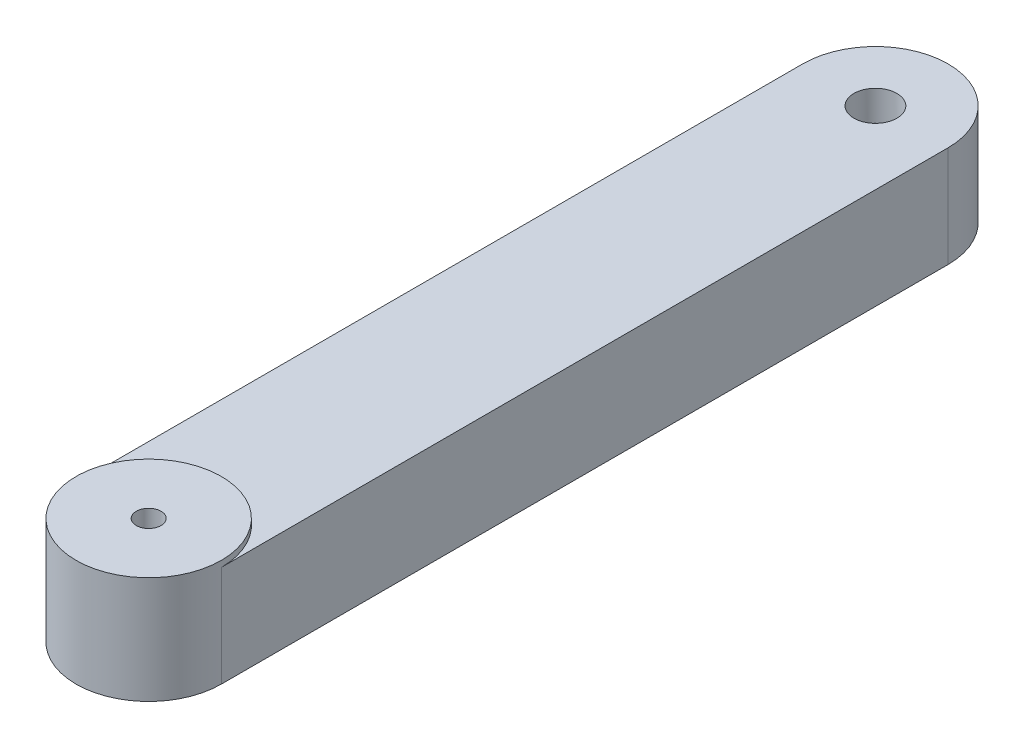
ISO-10303-21;
HEADER;
FILE_DESCRIPTION(('STEP AP214'),'2;1');
FILE_NAME('part.step','',(''),(''),'','','');
FILE_SCHEMA(('AUTOMOTIVE_DESIGN { 1 0 10303 214 1 1 1 1 }'));
ENDSEC;
DATA;
#1=APPLICATION_CONTEXT('core data for automotive mechanical design processes');
#2=APPLICATION_PROTOCOL_DEFINITION('international standard','automotive_design',2000,#1);
#3=PRODUCT_CONTEXT('',#1,'mechanical');
#4=PRODUCT('Part','Part','',(#3));
#5=PRODUCT_RELATED_PRODUCT_CATEGORY('part','',(#4));
#6=PRODUCT_DEFINITION_FORMATION('','',#4);
#7=PRODUCT_DEFINITION_CONTEXT('part definition',#1,'design');
#8=PRODUCT_DEFINITION('design','',#6,#7);
#9=PRODUCT_DEFINITION_SHAPE('','',#8);
#10=(LENGTH_UNIT() NAMED_UNIT(*) SI_UNIT(.MILLI.,.METRE.));
#11=(NAMED_UNIT(*) PLANE_ANGLE_UNIT() SI_UNIT($,.RADIAN.));
#12=(NAMED_UNIT(*) SI_UNIT($,.STERADIAN.) SOLID_ANGLE_UNIT());
#13=UNCERTAINTY_MEASURE_WITH_UNIT(LENGTH_MEASURE(1.E-05),#10,'distance_accuracy_value','');
#14=(GEOMETRIC_REPRESENTATION_CONTEXT(3) GLOBAL_UNCERTAINTY_ASSIGNED_CONTEXT((#13)) GLOBAL_UNIT_ASSIGNED_CONTEXT((#10,
#11,#12)) REPRESENTATION_CONTEXT('',''));
#15=CARTESIAN_POINT('',(0.,0.,0.));
#16=DIRECTION('',(0.,0.,1.));
#17=DIRECTION('',(1.,0.,0.));
#18=AXIS2_PLACEMENT_3D('',#15,#16,#17);
#19=CARTESIAN_POINT('',(0.,17.7,60.));
#20=DIRECTION('',(0.,1.,0.));
#21=DIRECTION('',(0.,0.,1.));
#22=AXIS2_PLACEMENT_3D('',#19,#20,#21);
#23=PLANE('',#22);
#24=CARTESIAN_POINT('',(0.,17.7,60.));
#25=DIRECTION('',(0.,1.,0.));
#26=DIRECTION('',(0.,0.,1.));
#27=AXIS2_PLACEMENT_3D('',#24,#25,#26);
#28=CIRCLE('',#27,2.05);
#29=CARTESIAN_POINT('',(0.,17.7,62.05));
#30=VERTEX_POINT('',#29);
#31=EDGE_CURVE('E116',#30,#30,#28,.T.);
#32=ORIENTED_EDGE('',*,*,#31,.F.);
#33=EDGE_LOOP('',(#32));
#34=FACE_BOUND('',#33,.T.);
#35=CARTESIAN_POINT('',(0.,17.7,60.));
#36=DIRECTION('',(0.,1.,0.));
#37=DIRECTION('',(0.,0.,1.));
#38=AXIS2_PLACEMENT_3D('',#35,#36,#37);
#39=CIRCLE('',#38,12.);
#40=CARTESIAN_POINT('',(0.,17.7,72.));
#41=VERTEX_POINT('',#40);
#42=EDGE_CURVE('E117',#41,#41,#39,.T.);
#43=ORIENTED_EDGE('',*,*,#42,.T.);
#44=EDGE_LOOP('',(#43));
#45=FACE_BOUND('',#44,.T.);
#46=ADVANCED_FACE('F44',(#34,#45),#23,.T.);
#47=CARTESIAN_POINT('',(12.,17.7,60.));
#48=DIRECTION('',(-1.,0.,0.));
#49=DIRECTION('',(0.,0.,1.));
#50=AXIS2_PLACEMENT_3D('',#47,#48,#49);
#51=PLANE('',#50);
#52=DIRECTION('',(0.,0.,-1.));
#53=VECTOR('',#52,1.);
#54=CARTESIAN_POINT('',(12.,16.7,60.));
#55=LINE('',#54,#53);
#56=CARTESIAN_POINT('',(12.,16.7,60.));
#57=VERTEX_POINT('',#56);
#58=CARTESIAN_POINT('',(12.,16.7,-60.));
#59=VERTEX_POINT('',#58);
#60=EDGE_CURVE('E93',#57,#59,#55,.T.);
#61=ORIENTED_EDGE('',*,*,#60,.F.);
#62=DIRECTION('',(0.,-1.,0.));
#63=VECTOR('',#62,1.);
#64=CARTESIAN_POINT('',(12.,17.7,60.));
#65=LINE('',#64,#63);
#66=CARTESIAN_POINT('',(12.,0.,60.));
#67=VERTEX_POINT('',#66);
#68=EDGE_CURVE('E11',#57,#67,#65,.T.);
#69=ORIENTED_EDGE('',*,*,#68,.T.);
#70=DIRECTION('',(0.,0.,-1.));
#71=VECTOR('',#70,1.);
#72=CARTESIAN_POINT('',(12.,0.,60.));
#73=LINE('',#72,#71);
#74=CARTESIAN_POINT('',(12.,0.,-60.));
#75=VERTEX_POINT('',#74);
#76=EDGE_CURVE('E108',#67,#75,#73,.T.);
#77=ORIENTED_EDGE('',*,*,#76,.T.);
#78=DIRECTION('',(0.,-1.,0.));
#79=VECTOR('',#78,1.);
#80=CARTESIAN_POINT('',(12.,17.7,-60.));
#81=LINE('',#80,#79);
#82=EDGE_CURVE('E54',#59,#75,#81,.T.);
#83=ORIENTED_EDGE('',*,*,#82,.F.);
#84=EDGE_LOOP('',(#61,#69,#77,#83));
#85=FACE_BOUND('',#84,.T.);
#86=ADVANCED_FACE('F98',(#85),#51,.F.);
#87=CARTESIAN_POINT('',(0.,17.7,-60.));
#88=DIRECTION('',(0.,-1.,0.));
#89=DIRECTION('',(0.,0.,-1.));
#90=AXIS2_PLACEMENT_3D('',#87,#88,#89);
#91=CYLINDRICAL_SURFACE('',#90,12.);
#92=CARTESIAN_POINT('',(0.,16.7,-60.));
#93=DIRECTION('',(0.,1.,0.));
#94=DIRECTION('',(0.,0.,1.));
#95=AXIS2_PLACEMENT_3D('',#92,#93,#94);
#96=CIRCLE('',#95,12.);
#97=CARTESIAN_POINT('',(-12.,16.7,-60.));
#98=VERTEX_POINT('',#97);
#99=EDGE_CURVE('E65',#59,#98,#96,.T.);
#100=ORIENTED_EDGE('',*,*,#99,.F.);
#101=ORIENTED_EDGE('',*,*,#82,.T.);
#102=CARTESIAN_POINT('',(0.,0.,-60.));
#103=DIRECTION('',(0.,1.,0.));
#104=DIRECTION('',(0.,0.,1.));
#105=AXIS2_PLACEMENT_3D('',#102,#103,#104);
#106=CIRCLE('',#105,12.);
#107=CARTESIAN_POINT('',(-12.,0.,-60.));
#108=VERTEX_POINT('',#107);
#109=EDGE_CURVE('E111',#75,#108,#106,.T.);
#110=ORIENTED_EDGE('',*,*,#109,.T.);
#111=DIRECTION('',(0.,-1.,0.));
#112=VECTOR('',#111,1.);
#113=CARTESIAN_POINT('',(-12.,17.7,-60.));
#114=LINE('',#113,#112);
#115=EDGE_CURVE('E128',#98,#108,#114,.T.);
#116=ORIENTED_EDGE('',*,*,#115,.F.);
#117=EDGE_LOOP('',(#100,#101,#110,#116));
#118=FACE_BOUND('',#117,.T.);
#119=ADVANCED_FACE('F190',(#118),#91,.T.);
#120=CARTESIAN_POINT('',(-12.,17.7,60.));
#121=DIRECTION('',(1.,0.,0.));
#122=DIRECTION('',(0.,0.,-1.));
#123=AXIS2_PLACEMENT_3D('',#120,#121,#122);
#124=PLANE('',#123);
#125=DIRECTION('',(0.,0.,1.));
#126=VECTOR('',#125,1.);
#127=CARTESIAN_POINT('',(-12.,16.7,-60.));
#128=LINE('',#127,#126);
#129=CARTESIAN_POINT('',(-12.,16.7,60.));
#130=VERTEX_POINT('',#129);
#131=EDGE_CURVE('E95',#98,#130,#128,.T.);
#132=ORIENTED_EDGE('',*,*,#131,.F.);
#133=ORIENTED_EDGE('',*,*,#115,.T.);
#134=DIRECTION('',(0.,0.,1.));
#135=VECTOR('',#134,1.);
#136=CARTESIAN_POINT('',(-12.,0.,60.));
#137=LINE('',#136,#135);
#138=CARTESIAN_POINT('',(-12.,0.,60.));
#139=VERTEX_POINT('',#138);
#140=EDGE_CURVE('E123',#108,#139,#137,.T.);
#141=ORIENTED_EDGE('',*,*,#140,.T.);
#142=DIRECTION('',(0.,-1.,0.));
#143=VECTOR('',#142,1.);
#144=CARTESIAN_POINT('',(-12.,17.7,60.));
#145=LINE('',#144,#143);
#146=EDGE_CURVE('E72',#130,#139,#145,.T.);
#147=ORIENTED_EDGE('',*,*,#146,.F.);
#148=EDGE_LOOP('',(#132,#133,#141,#147));
#149=FACE_BOUND('',#148,.T.);
#150=ADVANCED_FACE('F185',(#149),#124,.F.);
#151=CARTESIAN_POINT('',(0.,17.7,-60.));
#152=DIRECTION('',(0.,-1.,0.));
#153=DIRECTION('',(0.,0.,-1.));
#154=AXIS2_PLACEMENT_3D('',#151,#152,#153);
#155=CYLINDRICAL_SURFACE('',#154,2.05);
#156=CARTESIAN_POINT('',(0.,0.,-60.));
#157=DIRECTION('',(0.,1.,0.));
#158=DIRECTION('',(0.,0.,1.));
#159=AXIS2_PLACEMENT_3D('',#156,#157,#158);
#160=CIRCLE('',#159,2.05);
#161=CARTESIAN_POINT('',(0.,0.,-57.95));
#162=VERTEX_POINT('',#161);
#163=EDGE_CURVE('E109',#162,#162,#160,.T.);
#164=ORIENTED_EDGE('',*,*,#163,.F.);
#165=EDGE_LOOP('',(#164));
#166=FACE_BOUND('',#165,.T.);
#167=CARTESIAN_POINT('',(0.,11.7,-60.));
#168=DIRECTION('',(0.,1.,0.));
#169=DIRECTION('',(0.,0.,1.));
#170=AXIS2_PLACEMENT_3D('',#167,#168,#169);
#171=CIRCLE('',#170,2.05);
#172=CARTESIAN_POINT('',(0.,11.7,-57.95));
#173=VERTEX_POINT('',#172);
#174=EDGE_CURVE('E133',#173,#173,#171,.T.);
#175=ORIENTED_EDGE('',*,*,#174,.T.);
#176=EDGE_LOOP('',(#175));
#177=FACE_BOUND('',#176,.T.);
#178=ADVANCED_FACE('F180',(#166,#177),#155,.F.);
#179=CARTESIAN_POINT('',(0.,0.,60.));
#180=DIRECTION('',(0.,1.,0.));
#181=DIRECTION('',(0.,0.,1.));
#182=AXIS2_PLACEMENT_3D('',#179,#180,#181);
#183=PLANE('',#182);
#184=CARTESIAN_POINT('',(0.,0.,60.));
#185=DIRECTION('',(0.,1.,0.));
#186=DIRECTION('',(0.,0.,1.));
#187=AXIS2_PLACEMENT_3D('',#184,#185,#186);
#188=CIRCLE('',#187,12.);
#189=EDGE_CURVE('E104',#139,#67,#188,.T.);
#190=ORIENTED_EDGE('',*,*,#189,.F.);
#191=ORIENTED_EDGE('',*,*,#140,.F.);
#192=ORIENTED_EDGE('',*,*,#109,.F.);
#193=ORIENTED_EDGE('',*,*,#76,.F.);
#194=EDGE_LOOP('',(#190,#191,#192,#193));
#195=FACE_BOUND('',#194,.T.);
#196=ORIENTED_EDGE('',*,*,#163,.T.);
#197=EDGE_LOOP('',(#196));
#198=FACE_BOUND('',#197,.T.);
#199=CARTESIAN_POINT('',(0.,0.,60.));
#200=DIRECTION('',(0.,1.,0.));
#201=DIRECTION('',(0.,0.,1.));
#202=AXIS2_PLACEMENT_3D('',#199,#200,#201);
#203=CIRCLE('',#202,2.05);
#204=CARTESIAN_POINT('',(0.,0.,62.05));
#205=VERTEX_POINT('',#204);
#206=EDGE_CURVE('E140',#205,#205,#203,.T.);
#207=ORIENTED_EDGE('',*,*,#206,.T.);
#208=EDGE_LOOP('',(#207));
#209=FACE_BOUND('',#208,.T.);
#210=ADVANCED_FACE('F169',(#195,#198,#209),#183,.F.);
#211=CARTESIAN_POINT('',(0.,17.7,60.));
#212=DIRECTION('',(0.,-1.,0.));
#213=DIRECTION('',(0.,0.,-1.));
#214=AXIS2_PLACEMENT_3D('',#211,#212,#213);
#215=CYLINDRICAL_SURFACE('',#214,12.);
#216=ORIENTED_EDGE('',*,*,#68,.F.);
#217=CARTESIAN_POINT('',(0.,16.7,60.));
#218=DIRECTION('',(0.,-1.,0.));
#219=DIRECTION('',(0.,0.,-1.));
#220=AXIS2_PLACEMENT_3D('',#217,#218,#219);
#221=CIRCLE('',#220,12.);
#222=EDGE_CURVE('E87',#130,#57,#221,.T.);
#223=ORIENTED_EDGE('',*,*,#222,.F.);
#224=ORIENTED_EDGE('',*,*,#146,.T.);
#225=ORIENTED_EDGE('',*,*,#189,.T.);
#226=EDGE_LOOP('',(#216,#223,#224,#225));
#227=FACE_BOUND('',#226,.T.);
#228=ORIENTED_EDGE('',*,*,#42,.F.);
#229=EDGE_LOOP('',(#228));
#230=FACE_BOUND('',#229,.T.);
#231=ADVANCED_FACE('F50',(#227,#230),#215,.T.);
#232=CARTESIAN_POINT('',(0.,17.7,60.));
#233=DIRECTION('',(0.,-1.,0.));
#234=DIRECTION('',(0.,0.,-1.));
#235=AXIS2_PLACEMENT_3D('',#232,#233,#234);
#236=CYLINDRICAL_SURFACE('',#235,2.05);
#237=ORIENTED_EDGE('',*,*,#31,.T.);
#238=EDGE_LOOP('',(#237));
#239=FACE_BOUND('',#238,.T.);
#240=ORIENTED_EDGE('',*,*,#206,.F.);
#241=EDGE_LOOP('',(#240));
#242=FACE_BOUND('',#241,.T.);
#243=ADVANCED_FACE('F158',(#239,#242),#236,.F.);
#244=CARTESIAN_POINT('',(0.,11.7,-60.));
#245=DIRECTION('',(0.,1.,0.));
#246=DIRECTION('',(0.,0.,1.));
#247=AXIS2_PLACEMENT_3D('',#244,#245,#246);
#248=CYLINDRICAL_SURFACE('',#247,3.55);
#249=CARTESIAN_POINT('',(0.,16.7,-60.));
#250=DIRECTION('',(0.,-1.,0.));
#251=DIRECTION('',(0.,0.,-1.));
#252=AXIS2_PLACEMENT_3D('',#249,#250,#251);
#253=CIRCLE('',#252,3.55);
#254=CARTESIAN_POINT('',(0.,16.7,-63.55));
#255=VERTEX_POINT('',#254);
#256=EDGE_CURVE('E47',#255,#255,#253,.F.);
#257=ORIENTED_EDGE('',*,*,#256,.T.);
#258=EDGE_LOOP('',(#257));
#259=FACE_BOUND('',#258,.T.);
#260=CARTESIAN_POINT('',(0.,11.7,-60.));
#261=DIRECTION('',(0.,1.,0.));
#262=DIRECTION('',(0.,0.,1.));
#263=AXIS2_PLACEMENT_3D('',#260,#261,#262);
#264=CIRCLE('',#263,3.55);
#265=CARTESIAN_POINT('',(0.,11.7,-56.45));
#266=VERTEX_POINT('',#265);
#267=EDGE_CURVE('E139',#266,#266,#264,.T.);
#268=ORIENTED_EDGE('',*,*,#267,.F.);
#269=EDGE_LOOP('',(#268));
#270=FACE_BOUND('',#269,.T.);
#271=ADVANCED_FACE('F173',(#259,#270),#248,.F.);
#272=CARTESIAN_POINT('',(0.,11.7,-60.));
#273=DIRECTION('',(0.,1.,0.));
#274=DIRECTION('',(0.,0.,1.));
#275=AXIS2_PLACEMENT_3D('',#272,#273,#274);
#276=PLANE('',#275);
#277=ORIENTED_EDGE('',*,*,#174,.F.);
#278=EDGE_LOOP('',(#277));
#279=FACE_BOUND('',#278,.T.);
#280=ORIENTED_EDGE('',*,*,#267,.T.);
#281=EDGE_LOOP('',(#280));
#282=FACE_BOUND('',#281,.T.);
#283=ADVANCED_FACE('F215',(#279,#282),#276,.T.);
#284=CARTESIAN_POINT('',(0.,16.7,60.));
#285=DIRECTION('',(0.,-1.,0.));
#286=DIRECTION('',(0.,0.,-1.));
#287=AXIS2_PLACEMENT_3D('',#284,#285,#286);
#288=PLANE('',#287);
#289=ORIENTED_EDGE('',*,*,#222,.T.);
#290=ORIENTED_EDGE('',*,*,#60,.T.);
#291=ORIENTED_EDGE('',*,*,#99,.T.);
#292=ORIENTED_EDGE('',*,*,#131,.T.);
#293=EDGE_LOOP('',(#289,#290,#291,#292));
#294=FACE_BOUND('',#293,.T.);
#295=ORIENTED_EDGE('',*,*,#256,.F.);
#296=EDGE_LOOP('',(#295));
#297=FACE_BOUND('',#296,.T.);
#298=ADVANCED_FACE('F90',(#294,#297),#288,.F.);
#299=CLOSED_SHELL('',(#46,#86,#119,#150,#178,#210,#231,#243,#271,#283,#298));
#300=MANIFOLD_SOLID_BREP('B2',#299);
#301=ADVANCED_BREP_SHAPE_REPRESENTATION('',(#18,#300),#14);
#302=SHAPE_DEFINITION_REPRESENTATION(#9,#301);
ENDSEC;
END-ISO-10303-21;
